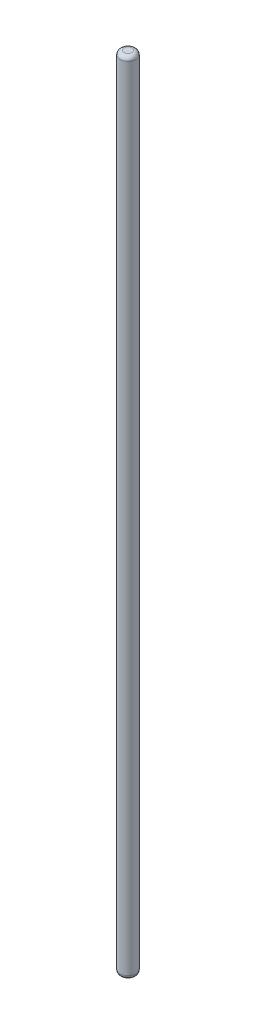
ISO-10303-21;
HEADER;
FILE_DESCRIPTION(('STEP AP214'),'2;1');
FILE_NAME('part.step','',(''),(''),'','','');
FILE_SCHEMA(('AUTOMOTIVE_DESIGN { 1 0 10303 214 1 1 1 1 }'));
ENDSEC;
DATA;
#1=APPLICATION_CONTEXT('core data for automotive mechanical design processes');
#2=APPLICATION_PROTOCOL_DEFINITION('international standard','automotive_design',2000,#1);
#3=PRODUCT_CONTEXT('',#1,'mechanical');
#4=PRODUCT('Part','Part','',(#3));
#5=PRODUCT_RELATED_PRODUCT_CATEGORY('part','',(#4));
#6=PRODUCT_DEFINITION_FORMATION('','',#4);
#7=PRODUCT_DEFINITION_CONTEXT('part definition',#1,'design');
#8=PRODUCT_DEFINITION('design','',#6,#7);
#9=PRODUCT_DEFINITION_SHAPE('','',#8);
#10=(LENGTH_UNIT() NAMED_UNIT(*) SI_UNIT(.MILLI.,.METRE.));
#11=(NAMED_UNIT(*) PLANE_ANGLE_UNIT() SI_UNIT($,.RADIAN.));
#12=(NAMED_UNIT(*) SI_UNIT($,.STERADIAN.) SOLID_ANGLE_UNIT());
#13=UNCERTAINTY_MEASURE_WITH_UNIT(LENGTH_MEASURE(1.E-05),#10,'distance_accuracy_value','');
#14=(GEOMETRIC_REPRESENTATION_CONTEXT(3) GLOBAL_UNCERTAINTY_ASSIGNED_CONTEXT((#13)) GLOBAL_UNIT_ASSIGNED_CONTEXT((#10,
#11,#12)) REPRESENTATION_CONTEXT('',''));
#15=CARTESIAN_POINT('',(0.,0.,0.));
#16=DIRECTION('',(0.,0.,1.));
#17=DIRECTION('',(1.,0.,0.));
#18=AXIS2_PLACEMENT_3D('',#15,#16,#17);
#19=CARTESIAN_POINT('',(0.,300.,0.));
#20=DIRECTION('',(0.,-1.,0.));
#21=DIRECTION('',(0.,0.,-1.));
#22=AXIS2_PLACEMENT_3D('',#19,#20,#21);
#23=CYLINDRICAL_SURFACE('',#22,3.);
#24=CARTESIAN_POINT('',(0.,298.5,0.));
#25=DIRECTION('',(0.,1.,0.));
#26=DIRECTION('',(0.,0.,1.));
#27=AXIS2_PLACEMENT_3D('',#24,#25,#26);
#28=CIRCLE('',#27,3.);
#29=CARTESIAN_POINT('',(0.,298.5,3.));
#30=VERTEX_POINT('',#29);
#31=EDGE_CURVE('E50',#30,#30,#28,.F.);
#32=ORIENTED_EDGE('',*,*,#31,.T.);
#33=EDGE_LOOP('',(#32));
#34=FACE_BOUND('',#33,.T.);
#35=CARTESIAN_POINT('',(0.,1.5,0.));
#36=DIRECTION('',(0.,1.,0.));
#37=DIRECTION('',(0.,0.,1.));
#38=AXIS2_PLACEMENT_3D('',#35,#36,#37);
#39=CIRCLE('',#38,3.);
#40=CARTESIAN_POINT('',(0.,1.5,3.));
#41=VERTEX_POINT('',#40);
#42=EDGE_CURVE('E54',#41,#41,#39,.T.);
#43=ORIENTED_EDGE('',*,*,#42,.T.);
#44=EDGE_LOOP('',(#43));
#45=FACE_BOUND('',#44,.T.);
#46=ADVANCED_FACE('F43',(#34,#45),#23,.T.);
#47=CARTESIAN_POINT('',(0.,300.,0.));
#48=DIRECTION('',(0.,1.,0.));
#49=DIRECTION('',(0.,0.,1.));
#50=AXIS2_PLACEMENT_3D('',#47,#48,#49);
#51=PLANE('',#50);
#52=CARTESIAN_POINT('',(0.,300.,0.));
#53=DIRECTION('',(0.,1.,0.));
#54=DIRECTION('',(0.,0.,1.));
#55=AXIS2_PLACEMENT_3D('',#52,#53,#54);
#56=CIRCLE('',#55,1.5);
#57=CARTESIAN_POINT('',(0.,300.,1.5));
#58=VERTEX_POINT('',#57);
#59=EDGE_CURVE('E58',#58,#58,#56,.T.);
#60=ORIENTED_EDGE('',*,*,#59,.T.);
#61=EDGE_LOOP('',(#60));
#62=FACE_BOUND('',#61,.T.);
#63=ADVANCED_FACE('F64',(#62),#51,.T.);
#64=CARTESIAN_POINT('',(0.,0.,0.));
#65=DIRECTION('',(0.,1.,0.));
#66=DIRECTION('',(0.,0.,1.));
#67=AXIS2_PLACEMENT_3D('',#64,#65,#66);
#68=PLANE('',#67);
#69=CARTESIAN_POINT('',(0.,0.,0.));
#70=DIRECTION('',(0.,1.,0.));
#71=DIRECTION('',(0.,0.,1.));
#72=AXIS2_PLACEMENT_3D('',#69,#70,#71);
#73=CIRCLE('',#72,1.5);
#74=CARTESIAN_POINT('',(0.,0.,1.5));
#75=VERTEX_POINT('',#74);
#76=EDGE_CURVE('E10',#75,#75,#73,.F.);
#77=ORIENTED_EDGE('',*,*,#76,.T.);
#78=EDGE_LOOP('',(#77));
#79=FACE_BOUND('',#78,.T.);
#80=ADVANCED_FACE('F68',(#79),#68,.F.);
#81=CARTESIAN_POINT('',(0.,298.5,0.));
#82=DIRECTION('',(0.,1.,0.));
#83=DIRECTION('',(0.,0.,1.));
#84=AXIS2_PLACEMENT_3D('',#81,#82,#83);
#85=DEGENERATE_TOROIDAL_SURFACE('',#84,1.5,1.5,.T.);
#86=ORIENTED_EDGE('',*,*,#31,.F.);
#87=EDGE_LOOP('',(#86));
#88=FACE_BOUND('',#87,.T.);
#89=ORIENTED_EDGE('',*,*,#59,.F.);
#90=EDGE_LOOP('',(#89));
#91=FACE_BOUND('',#90,.T.);
#92=ADVANCED_FACE('F66',(#88,#91),#85,.T.);
#93=CARTESIAN_POINT('',(0.,1.5,0.));
#94=DIRECTION('',(0.,1.,0.));
#95=DIRECTION('',(0.,0.,1.));
#96=AXIS2_PLACEMENT_3D('',#93,#94,#95);
#97=DEGENERATE_TOROIDAL_SURFACE('',#96,1.5,1.5,.T.);
#98=ORIENTED_EDGE('',*,*,#76,.F.);
#99=EDGE_LOOP('',(#98));
#100=FACE_BOUND('',#99,.T.);
#101=ORIENTED_EDGE('',*,*,#42,.F.);
#102=EDGE_LOOP('',(#101));
#103=FACE_BOUND('',#102,.T.);
#104=ADVANCED_FACE('F45',(#100,#103),#97,.T.);
#105=CLOSED_SHELL('',(#46,#63,#80,#92,#104));
#106=MANIFOLD_SOLID_BREP('B2',#105);
#107=ADVANCED_BREP_SHAPE_REPRESENTATION('',(#18,#106),#14);
#108=SHAPE_DEFINITION_REPRESENTATION(#9,#107);
ENDSEC;
END-ISO-10303-21;
